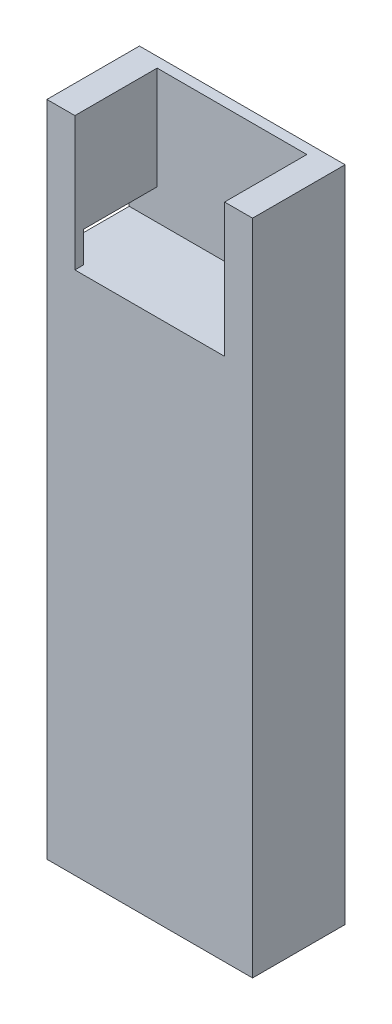
ISO-10303-21;
HEADER;
FILE_DESCRIPTION(('STEP AP214'),'2;1');
FILE_NAME('part.step','',(''),(''),'','','');
FILE_SCHEMA(('AUTOMOTIVE_DESIGN { 1 0 10303 214 1 1 1 1 }'));
ENDSEC;
DATA;
#1=APPLICATION_CONTEXT('core data for automotive mechanical design processes');
#2=APPLICATION_PROTOCOL_DEFINITION('international standard','automotive_design',2000,#1);
#3=PRODUCT_CONTEXT('',#1,'mechanical');
#4=PRODUCT('Part','Part','',(#3));
#5=PRODUCT_RELATED_PRODUCT_CATEGORY('part','',(#4));
#6=PRODUCT_DEFINITION_FORMATION('','',#4);
#7=PRODUCT_DEFINITION_CONTEXT('part definition',#1,'design');
#8=PRODUCT_DEFINITION('design','',#6,#7);
#9=PRODUCT_DEFINITION_SHAPE('','',#8);
#10=(LENGTH_UNIT() NAMED_UNIT(*) SI_UNIT(.MILLI.,.METRE.));
#11=(NAMED_UNIT(*) PLANE_ANGLE_UNIT() SI_UNIT($,.RADIAN.));
#12=(NAMED_UNIT(*) SI_UNIT($,.STERADIAN.) SOLID_ANGLE_UNIT());
#13=UNCERTAINTY_MEASURE_WITH_UNIT(LENGTH_MEASURE(1.E-05),#10,'distance_accuracy_value','');
#14=(GEOMETRIC_REPRESENTATION_CONTEXT(3) GLOBAL_UNCERTAINTY_ASSIGNED_CONTEXT((#13)) GLOBAL_UNIT_ASSIGNED_CONTEXT((#10,
#11,#12)) REPRESENTATION_CONTEXT('',''));
#15=CARTESIAN_POINT('',(0.,0.,0.));
#16=DIRECTION('',(0.,0.,1.));
#17=DIRECTION('',(1.,0.,0.));
#18=AXIS2_PLACEMENT_3D('',#15,#16,#17);
#19=CARTESIAN_POINT('',(0.,0.,0.));
#20=DIRECTION('',(0.,-1.,0.));
#21=DIRECTION('',(0.,0.,-1.));
#22=AXIS2_PLACEMENT_3D('',#19,#20,#21);
#23=PLANE('',#22);
#24=DIRECTION('',(0.,0.,1.));
#25=VECTOR('',#24,1.);
#26=CARTESIAN_POINT('',(0.,0.,0.));
#27=LINE('',#26,#25);
#28=CARTESIAN_POINT('',(0.,0.,-14.2875));
#29=VERTEX_POINT('',#28);
#30=CARTESIAN_POINT('',(0.,0.,0.));
#31=VERTEX_POINT('',#30);
#32=EDGE_CURVE('E359',#29,#31,#27,.T.);
#33=ORIENTED_EDGE('',*,*,#32,.F.);
#34=DIRECTION('',(-1.,0.,0.));
#35=VECTOR('',#34,1.);
#36=CARTESIAN_POINT('',(0.,0.,-14.2875));
#37=LINE('',#36,#35);
#38=CARTESIAN_POINT('',(31.75,0.,-14.2875));
#39=VERTEX_POINT('',#38);
#40=EDGE_CURVE('E374',#39,#29,#37,.T.);
#41=ORIENTED_EDGE('',*,*,#40,.F.);
#42=DIRECTION('',(0.,0.,-1.));
#43=VECTOR('',#42,1.);
#44=CARTESIAN_POINT('',(31.75,0.,0.));
#45=LINE('',#44,#43);
#46=CARTESIAN_POINT('',(31.75,0.,0.));
#47=VERTEX_POINT('',#46);
#48=EDGE_CURVE('E392',#47,#39,#45,.T.);
#49=ORIENTED_EDGE('',*,*,#48,.F.);
#50=DIRECTION('',(1.,0.,0.));
#51=VECTOR('',#50,1.);
#52=CARTESIAN_POINT('',(0.,0.,0.));
#53=LINE('',#52,#51);
#54=EDGE_CURVE('E389',#31,#47,#53,.T.);
#55=ORIENTED_EDGE('',*,*,#54,.F.);
#56=EDGE_LOOP('',(#33,#41,#49,#55));
#57=FACE_BOUND('',#56,.T.);
#58=DIRECTION('',(-1.,0.,0.));
#59=VECTOR('',#58,1.);
#60=CARTESIAN_POINT('',(0.,0.,-12.2555));
#61=LINE('',#60,#59);
#62=CARTESIAN_POINT('',(29.718,0.,-12.2555));
#63=VERTEX_POINT('',#62);
#64=CARTESIAN_POINT('',(2.032,0.,-12.2555));
#65=VERTEX_POINT('',#64);
#66=EDGE_CURVE('E223',#63,#65,#61,.T.);
#67=ORIENTED_EDGE('',*,*,#66,.T.);
#68=DIRECTION('',(0.,0.,1.));
#69=VECTOR('',#68,1.);
#70=CARTESIAN_POINT('',(2.032,0.,0.));
#71=LINE('',#70,#69);
#72=CARTESIAN_POINT('',(2.032,0.,-2.032));
#73=VERTEX_POINT('',#72);
#74=EDGE_CURVE('E251',#65,#73,#71,.T.);
#75=ORIENTED_EDGE('',*,*,#74,.T.);
#76=DIRECTION('',(1.,0.,0.));
#77=VECTOR('',#76,1.);
#78=CARTESIAN_POINT('',(0.,0.,-2.032));
#79=LINE('',#78,#77);
#80=CARTESIAN_POINT('',(29.718,0.,-2.032));
#81=VERTEX_POINT('',#80);
#82=EDGE_CURVE('E276',#73,#81,#79,.T.);
#83=ORIENTED_EDGE('',*,*,#82,.T.);
#84=DIRECTION('',(0.,0.,-1.));
#85=VECTOR('',#84,1.);
#86=CARTESIAN_POINT('',(29.718,0.,0.));
#87=LINE('',#86,#85);
#88=EDGE_CURVE('E62',#81,#63,#87,.T.);
#89=ORIENTED_EDGE('',*,*,#88,.T.);
#90=EDGE_LOOP('',(#67,#75,#83,#89));
#91=FACE_BOUND('',#90,.T.);
#92=ADVANCED_FACE('F46',(#57,#91),#23,.T.);
#93=CARTESIAN_POINT('',(0.,101.6,0.));
#94=DIRECTION('',(1.,0.,0.));
#95=DIRECTION('',(0.,0.,-1.));
#96=AXIS2_PLACEMENT_3D('',#93,#94,#95);
#97=PLANE('',#96);
#98=DIRECTION('',(0.,1.,0.));
#99=VECTOR('',#98,1.);
#100=CARTESIAN_POINT('',(0.,85.725,-1.35426272486975));
#101=LINE('',#100,#99);
#102=CARTESIAN_POINT('',(0.,80.9625,-1.35426272486975));
#103=VERTEX_POINT('',#102);
#104=CARTESIAN_POINT('',(0.,85.725,-1.35426272486975));
#105=VERTEX_POINT('',#104);
#106=EDGE_CURVE('E301',#103,#105,#101,.T.);
#107=ORIENTED_EDGE('',*,*,#106,.F.);
#108=DIRECTION('',(0.,0.,1.));
#109=VECTOR('',#108,1.);
#110=CARTESIAN_POINT('',(0.,80.9625,-1.35426272486975));
#111=LINE('',#110,#109);
#112=CARTESIAN_POINT('',(0.,80.9625,-12.7));
#113=VERTEX_POINT('',#112);
#114=EDGE_CURVE('E70',#113,#103,#111,.T.);
#115=ORIENTED_EDGE('',*,*,#114,.F.);
#116=DIRECTION('',(0.,-1.,0.));
#117=VECTOR('',#116,1.);
#118=CARTESIAN_POINT('',(0.,80.9625,-12.7));
#119=LINE('',#118,#117);
#120=CARTESIAN_POINT('',(0.,85.725,-12.7));
#121=VERTEX_POINT('',#120);
#122=EDGE_CURVE('E309',#121,#113,#119,.T.);
#123=ORIENTED_EDGE('',*,*,#122,.F.);
#124=DIRECTION('',(0.,0.,-1.));
#125=VECTOR('',#124,1.);
#126=CARTESIAN_POINT('',(0.,85.725,-12.7));
#127=LINE('',#126,#125);
#128=EDGE_CURVE('E305',#105,#121,#127,.T.);
#129=ORIENTED_EDGE('',*,*,#128,.F.);
#130=EDGE_LOOP('',(#107,#115,#123,#129));
#131=FACE_BOUND('',#130,.T.);
#132=ORIENTED_EDGE('',*,*,#32,.T.);
#133=DIRECTION('',(0.,-1.,0.));
#134=VECTOR('',#133,1.);
#135=CARTESIAN_POINT('',(0.,101.6,0.));
#136=LINE('',#135,#134);
#137=CARTESIAN_POINT('',(0.,101.6,0.));
#138=VERTEX_POINT('',#137);
#139=EDGE_CURVE('E11',#138,#31,#136,.T.);
#140=ORIENTED_EDGE('',*,*,#139,.F.);
#141=DIRECTION('',(0.,0.,1.));
#142=VECTOR('',#141,1.);
#143=CARTESIAN_POINT('',(0.,101.6,0.));
#144=LINE('',#143,#142);
#145=CARTESIAN_POINT('',(0.,101.6,-14.2875));
#146=VERTEX_POINT('',#145);
#147=EDGE_CURVE('E369',#146,#138,#144,.T.);
#148=ORIENTED_EDGE('',*,*,#147,.F.);
#149=DIRECTION('',(0.,-1.,0.));
#150=VECTOR('',#149,1.);
#151=CARTESIAN_POINT('',(0.,101.6,-14.2875));
#152=LINE('',#151,#150);
#153=EDGE_CURVE('E385',#146,#29,#152,.T.);
#154=ORIENTED_EDGE('',*,*,#153,.T.);
#155=EDGE_LOOP('',(#132,#140,#148,#154));
#156=FACE_BOUND('',#155,.T.);
#157=ADVANCED_FACE('F48',(#131,#156),#97,.F.);
#158=CARTESIAN_POINT('',(0.,101.6,0.));
#159=DIRECTION('',(0.,0.,-1.));
#160=DIRECTION('',(-1.,0.,0.));
#161=AXIS2_PLACEMENT_3D('',#158,#159,#160);
#162=PLANE('',#161);
#163=DIRECTION('',(1.,0.,0.));
#164=VECTOR('',#163,1.);
#165=CARTESIAN_POINT('',(4.318,80.9625,0.));
#166=LINE('',#165,#164);
#167=CARTESIAN_POINT('',(4.318,80.9625,0.));
#168=VERTEX_POINT('',#167);
#169=CARTESIAN_POINT('',(27.432,80.9625,0.));
#170=VERTEX_POINT('',#169);
#171=EDGE_CURVE('E334',#168,#170,#166,.T.);
#172=ORIENTED_EDGE('',*,*,#171,.F.);
#173=DIRECTION('',(0.,1.,0.));
#174=VECTOR('',#173,1.);
#175=CARTESIAN_POINT('',(4.318,80.9625,0.));
#176=LINE('',#175,#174);
#177=CARTESIAN_POINT('',(4.318,101.6,0.));
#178=VERTEX_POINT('',#177);
#179=EDGE_CURVE('E346',#168,#178,#176,.T.);
#180=ORIENTED_EDGE('',*,*,#179,.T.);
#181=DIRECTION('',(1.,0.,0.));
#182=VECTOR('',#181,1.);
#183=CARTESIAN_POINT('',(0.,101.6,0.));
#184=LINE('',#183,#182);
#185=EDGE_CURVE('E375',#138,#178,#184,.T.);
#186=ORIENTED_EDGE('',*,*,#185,.F.);
#187=ORIENTED_EDGE('',*,*,#139,.T.);
#188=ORIENTED_EDGE('',*,*,#54,.T.);
#189=DIRECTION('',(0.,-1.,0.));
#190=VECTOR('',#189,1.);
#191=CARTESIAN_POINT('',(31.75,101.6,0.));
#192=LINE('',#191,#190);
#193=CARTESIAN_POINT('',(31.75,101.6,0.));
#194=VERTEX_POINT('',#193);
#195=EDGE_CURVE('E55',#194,#47,#192,.T.);
#196=ORIENTED_EDGE('',*,*,#195,.F.);
#197=CARTESIAN_POINT('',(27.432,101.6,0.));
#198=VERTEX_POINT('',#197);
#199=EDGE_CURVE('E373',#198,#194,#184,.T.);
#200=ORIENTED_EDGE('',*,*,#199,.F.);
#201=DIRECTION('',(0.,1.,0.));
#202=VECTOR('',#201,1.);
#203=CARTESIAN_POINT('',(27.432,80.9625,0.));
#204=LINE('',#203,#202);
#205=EDGE_CURVE('E363',#170,#198,#204,.T.);
#206=ORIENTED_EDGE('',*,*,#205,.F.);
#207=EDGE_LOOP('',(#172,#180,#186,#187,#188,#196,#200,#206));
#208=FACE_BOUND('',#207,.T.);
#209=ADVANCED_FACE('F486',(#208),#162,.F.);
#210=CARTESIAN_POINT('',(31.75,101.6,0.));
#211=DIRECTION('',(-1.,0.,0.));
#212=DIRECTION('',(0.,0.,1.));
#213=AXIS2_PLACEMENT_3D('',#210,#211,#212);
#214=PLANE('',#213);
#215=ORIENTED_EDGE('',*,*,#48,.T.);
#216=DIRECTION('',(0.,-1.,0.));
#217=VECTOR('',#216,1.);
#218=CARTESIAN_POINT('',(31.75,101.6,-14.2875));
#219=LINE('',#218,#217);
#220=CARTESIAN_POINT('',(31.75,101.6,-14.2875));
#221=VERTEX_POINT('',#220);
#222=EDGE_CURVE('E400',#221,#39,#219,.T.);
#223=ORIENTED_EDGE('',*,*,#222,.F.);
#224=DIRECTION('',(0.,0.,-1.));
#225=VECTOR('',#224,1.);
#226=CARTESIAN_POINT('',(31.75,101.6,0.));
#227=LINE('',#226,#225);
#228=EDGE_CURVE('E379',#194,#221,#227,.T.);
#229=ORIENTED_EDGE('',*,*,#228,.F.);
#230=ORIENTED_EDGE('',*,*,#195,.T.);
#231=EDGE_LOOP('',(#215,#223,#229,#230));
#232=FACE_BOUND('',#231,.T.);
#233=ADVANCED_FACE('F409',(#232),#214,.F.);
#234=CARTESIAN_POINT('',(0.,101.6,-14.2875));
#235=DIRECTION('',(0.,0.,1.));
#236=DIRECTION('',(1.,0.,0.));
#237=AXIS2_PLACEMENT_3D('',#234,#235,#236);
#238=PLANE('',#237);
#239=ORIENTED_EDGE('',*,*,#40,.T.);
#240=ORIENTED_EDGE('',*,*,#153,.F.);
#241=DIRECTION('',(-1.,0.,0.));
#242=VECTOR('',#241,1.);
#243=CARTESIAN_POINT('',(0.,101.6,-14.2875));
#244=LINE('',#243,#242);
#245=EDGE_CURVE('E382',#221,#146,#244,.T.);
#246=ORIENTED_EDGE('',*,*,#245,.F.);
#247=ORIENTED_EDGE('',*,*,#222,.T.);
#248=EDGE_LOOP('',(#239,#240,#246,#247));
#249=FACE_BOUND('',#248,.T.);
#250=ADVANCED_FACE('F419',(#249),#238,.F.);
#251=CARTESIAN_POINT('',(0.,101.6,0.));
#252=DIRECTION('',(0.,-1.,0.));
#253=DIRECTION('',(0.,0.,-1.));
#254=AXIS2_PLACEMENT_3D('',#251,#252,#253);
#255=PLANE('',#254);
#256=ORIENTED_EDGE('',*,*,#185,.T.);
#257=DIRECTION('',(0.,0.,1.));
#258=VECTOR('',#257,1.);
#259=CARTESIAN_POINT('',(4.318,101.6,0.));
#260=LINE('',#259,#258);
#261=CARTESIAN_POINT('',(4.318,101.6,-12.7));
#262=VERTEX_POINT('',#261);
#263=EDGE_CURVE('E330',#262,#178,#260,.T.);
#264=ORIENTED_EDGE('',*,*,#263,.F.);
#265=DIRECTION('',(-1.,0.,0.));
#266=VECTOR('',#265,1.);
#267=CARTESIAN_POINT('',(4.318,101.6,-12.7));
#268=LINE('',#267,#266);
#269=CARTESIAN_POINT('',(27.432,101.6,-12.7));
#270=VERTEX_POINT('',#269);
#271=EDGE_CURVE('E335',#270,#262,#268,.T.);
#272=ORIENTED_EDGE('',*,*,#271,.F.);
#273=DIRECTION('',(0.,0.,-1.));
#274=VECTOR('',#273,1.);
#275=CARTESIAN_POINT('',(27.432,101.6,0.));
#276=LINE('',#275,#274);
#277=EDGE_CURVE('E349',#198,#270,#276,.T.);
#278=ORIENTED_EDGE('',*,*,#277,.F.);
#279=ORIENTED_EDGE('',*,*,#199,.T.);
#280=ORIENTED_EDGE('',*,*,#228,.T.);
#281=ORIENTED_EDGE('',*,*,#245,.T.);
#282=ORIENTED_EDGE('',*,*,#147,.T.);
#283=EDGE_LOOP('',(#256,#264,#272,#278,#279,#280,#281,#282));
#284=FACE_BOUND('',#283,.T.);
#285=ADVANCED_FACE('F425',(#284),#255,.F.);
#286=CARTESIAN_POINT('',(4.318,80.9625,0.));
#287=DIRECTION('',(-1.,0.,0.));
#288=DIRECTION('',(0.,0.,1.));
#289=AXIS2_PLACEMENT_3D('',#286,#287,#288);
#290=PLANE('',#289);
#291=DIRECTION('',(0.,1.,0.));
#292=VECTOR('',#291,1.);
#293=CARTESIAN_POINT('',(4.318,80.9625,-1.35426272486975));
#294=LINE('',#293,#292);
#295=CARTESIAN_POINT('',(4.318,80.9625,-1.35426272486975));
#296=VERTEX_POINT('',#295);
#297=CARTESIAN_POINT('',(4.318,85.725,-1.35426272486975));
#298=VERTEX_POINT('',#297);
#299=EDGE_CURVE('E317',#296,#298,#294,.T.);
#300=ORIENTED_EDGE('',*,*,#299,.T.);
#301=DIRECTION('',(0.,0.,-1.));
#302=VECTOR('',#301,1.);
#303=CARTESIAN_POINT('',(4.318,85.725,0.));
#304=LINE('',#303,#302);
#305=CARTESIAN_POINT('',(4.318,85.725,-12.7));
#306=VERTEX_POINT('',#305);
#307=EDGE_CURVE('E326',#298,#306,#304,.T.);
#308=ORIENTED_EDGE('',*,*,#307,.T.);
#309=DIRECTION('',(0.,1.,0.));
#310=VECTOR('',#309,1.);
#311=CARTESIAN_POINT('',(4.318,80.9625,-12.7));
#312=LINE('',#311,#310);
#313=EDGE_CURVE('E356',#306,#262,#312,.T.);
#314=ORIENTED_EDGE('',*,*,#313,.T.);
#315=ORIENTED_EDGE('',*,*,#263,.T.);
#316=ORIENTED_EDGE('',*,*,#179,.F.);
#317=DIRECTION('',(0.,0.,1.));
#318=VECTOR('',#317,1.);
#319=CARTESIAN_POINT('',(4.318,80.9625,0.));
#320=LINE('',#319,#318);
#321=EDGE_CURVE('E331',#296,#168,#320,.T.);
#322=ORIENTED_EDGE('',*,*,#321,.F.);
#323=EDGE_LOOP('',(#300,#308,#314,#315,#316,#322));
#324=FACE_BOUND('',#323,.T.);
#325=ADVANCED_FACE('F504',(#324),#290,.F.);
#326=CARTESIAN_POINT('',(4.318,80.9625,-12.7));
#327=DIRECTION('',(0.,0.,-1.));
#328=DIRECTION('',(-1.,0.,0.));
#329=AXIS2_PLACEMENT_3D('',#326,#327,#328);
#330=PLANE('',#329);
#331=ORIENTED_EDGE('',*,*,#313,.F.);
#332=DIRECTION('',(-1.,0.,0.));
#333=VECTOR('',#332,1.);
#334=CARTESIAN_POINT('',(9.20749999999997,85.725,-12.7));
#335=LINE('',#334,#333);
#336=EDGE_CURVE('E314',#306,#121,#335,.T.);
#337=ORIENTED_EDGE('',*,*,#336,.T.);
#338=ORIENTED_EDGE('',*,*,#122,.T.);
#339=DIRECTION('',(-1.,0.,0.));
#340=VECTOR('',#339,1.);
#341=CARTESIAN_POINT('',(4.318,80.9625,-12.7));
#342=LINE('',#341,#340);
#343=CARTESIAN_POINT('',(27.432,80.9625,-12.7));
#344=VERTEX_POINT('',#343);
#345=EDGE_CURVE('E343',#344,#113,#342,.T.);
#346=ORIENTED_EDGE('',*,*,#345,.F.);
#347=DIRECTION('',(0.,1.,0.));
#348=VECTOR('',#347,1.);
#349=CARTESIAN_POINT('',(27.432,80.9625,-12.7));
#350=LINE('',#349,#348);
#351=EDGE_CURVE('E360',#344,#270,#350,.T.);
#352=ORIENTED_EDGE('',*,*,#351,.T.);
#353=ORIENTED_EDGE('',*,*,#271,.T.);
#354=EDGE_LOOP('',(#331,#337,#338,#346,#352,#353));
#355=FACE_BOUND('',#354,.T.);
#356=ADVANCED_FACE('F507',(#355),#330,.F.);
#357=CARTESIAN_POINT('',(27.432,80.9625,0.));
#358=DIRECTION('',(1.,0.,0.));
#359=DIRECTION('',(0.,0.,-1.));
#360=AXIS2_PLACEMENT_3D('',#357,#358,#359);
#361=PLANE('',#360);
#362=ORIENTED_EDGE('',*,*,#277,.T.);
#363=ORIENTED_EDGE('',*,*,#351,.F.);
#364=DIRECTION('',(0.,0.,-1.));
#365=VECTOR('',#364,1.);
#366=CARTESIAN_POINT('',(27.432,80.9625,0.));
#367=LINE('',#366,#365);
#368=EDGE_CURVE('E339',#170,#344,#367,.T.);
#369=ORIENTED_EDGE('',*,*,#368,.F.);
#370=ORIENTED_EDGE('',*,*,#205,.T.);
#371=EDGE_LOOP('',(#362,#363,#369,#370));
#372=FACE_BOUND('',#371,.T.);
#373=ADVANCED_FACE('F509',(#372),#361,.F.);
#374=CARTESIAN_POINT('',(0.,80.9625,0.));
#375=DIRECTION('',(0.,-1.,0.));
#376=DIRECTION('',(0.,0.,-1.));
#377=AXIS2_PLACEMENT_3D('',#374,#375,#376);
#378=PLANE('',#377);
#379=ORIENTED_EDGE('',*,*,#345,.T.);
#380=ORIENTED_EDGE('',*,*,#114,.T.);
#381=DIRECTION('',(-1.,0.,0.));
#382=VECTOR('',#381,1.);
#383=CARTESIAN_POINT('',(9.20749999999997,80.9625,-1.35426272486975));
#384=LINE('',#383,#382);
#385=EDGE_CURVE('E313',#296,#103,#384,.T.);
#386=ORIENTED_EDGE('',*,*,#385,.F.);
#387=ORIENTED_EDGE('',*,*,#321,.T.);
#388=ORIENTED_EDGE('',*,*,#171,.T.);
#389=ORIENTED_EDGE('',*,*,#368,.T.);
#390=EDGE_LOOP('',(#379,#380,#386,#387,#388,#389));
#391=FACE_BOUND('',#390,.T.);
#392=ADVANCED_FACE('F500',(#391),#378,.F.);
#393=CARTESIAN_POINT('',(9.20749999999997,85.725,-12.7));
#394=DIRECTION('',(0.,1.,0.));
#395=DIRECTION('',(0.,0.,1.));
#396=AXIS2_PLACEMENT_3D('',#393,#394,#395);
#397=PLANE('',#396);
#398=DIRECTION('',(-1.,0.,0.));
#399=VECTOR('',#398,1.);
#400=CARTESIAN_POINT('',(9.20749999999997,85.725,-1.35426272486975));
#401=LINE('',#400,#399);
#402=EDGE_CURVE('E318',#298,#105,#401,.T.);
#403=ORIENTED_EDGE('',*,*,#402,.T.);
#404=ORIENTED_EDGE('',*,*,#128,.T.);
#405=ORIENTED_EDGE('',*,*,#336,.F.);
#406=ORIENTED_EDGE('',*,*,#307,.F.);
#407=EDGE_LOOP('',(#403,#404,#405,#406));
#408=FACE_BOUND('',#407,.T.);
#409=ADVANCED_FACE('F515',(#408),#397,.F.);
#410=CARTESIAN_POINT('',(9.20749999999997,85.725,-1.35426272486975));
#411=DIRECTION('',(0.,0.,1.));
#412=DIRECTION('',(0.,-1.,0.));
#413=AXIS2_PLACEMENT_3D('',#410,#411,#412);
#414=PLANE('',#413);
#415=ORIENTED_EDGE('',*,*,#385,.T.);
#416=ORIENTED_EDGE('',*,*,#106,.T.);
#417=ORIENTED_EDGE('',*,*,#402,.F.);
#418=ORIENTED_EDGE('',*,*,#299,.F.);
#419=EDGE_LOOP('',(#415,#416,#417,#418));
#420=FACE_BOUND('',#419,.T.);
#421=ADVANCED_FACE('F564',(#420),#414,.F.);
#422=CARTESIAN_POINT('',(0.,101.6,-2.032));
#423=DIRECTION('',(0.,0.,-1.));
#424=DIRECTION('',(-1.,0.,0.));
#425=AXIS2_PLACEMENT_3D('',#422,#423,#424);
#426=PLANE('',#425);
#427=DIRECTION('',(1.,0.,0.));
#428=VECTOR('',#427,1.);
#429=CARTESIAN_POINT('',(0.,78.9305,-2.032));
#430=LINE('',#429,#428);
#431=CARTESIAN_POINT('',(2.032,78.9305,-2.032));
#432=VERTEX_POINT('',#431);
#433=CARTESIAN_POINT('',(29.464,78.9305,-2.032));
#434=VERTEX_POINT('',#433);
#435=EDGE_CURVE('E236',#432,#434,#430,.T.);
#436=ORIENTED_EDGE('',*,*,#435,.T.);
#437=DIRECTION('',(0.,1.,0.));
#438=VECTOR('',#437,1.);
#439=CARTESIAN_POINT('',(29.464,80.9625,-2.032));
#440=LINE('',#439,#438);
#441=CARTESIAN_POINT('',(29.464,99.568,-2.032));
#442=VERTEX_POINT('',#441);
#443=EDGE_CURVE('E244',#434,#442,#440,.T.);
#444=ORIENTED_EDGE('',*,*,#443,.T.);
#445=DIRECTION('',(1.,0.,0.));
#446=VECTOR('',#445,1.);
#447=CARTESIAN_POINT('',(0.,99.568,-2.032));
#448=LINE('',#447,#446);
#449=CARTESIAN_POINT('',(29.718,99.568,-2.032));
#450=VERTEX_POINT('',#449);
#451=EDGE_CURVE('E216',#442,#450,#448,.T.);
#452=ORIENTED_EDGE('',*,*,#451,.T.);
#453=DIRECTION('',(0.,-1.,0.));
#454=VECTOR('',#453,1.);
#455=CARTESIAN_POINT('',(29.718,101.6,-2.032));
#456=LINE('',#455,#454);
#457=EDGE_CURVE('E204',#450,#81,#456,.T.);
#458=ORIENTED_EDGE('',*,*,#457,.T.);
#459=ORIENTED_EDGE('',*,*,#82,.F.);
#460=DIRECTION('',(0.,-1.,0.));
#461=VECTOR('',#460,1.);
#462=CARTESIAN_POINT('',(2.032,101.6,-2.032));
#463=LINE('',#462,#461);
#464=EDGE_CURVE('E203',#432,#73,#463,.T.);
#465=ORIENTED_EDGE('',*,*,#464,.F.);
#466=EDGE_LOOP('',(#436,#444,#452,#458,#459,#465));
#467=FACE_BOUND('',#466,.T.);
#468=ADVANCED_FACE('F455',(#467),#426,.T.);
#469=CARTESIAN_POINT('',(2.032,101.6,0.));
#470=DIRECTION('',(1.,0.,0.));
#471=DIRECTION('',(0.,0.,-1.));
#472=AXIS2_PLACEMENT_3D('',#469,#470,#471);
#473=PLANE('',#472);
#474=ORIENTED_EDGE('',*,*,#464,.T.);
#475=ORIENTED_EDGE('',*,*,#74,.F.);
#476=DIRECTION('',(0.,-1.,0.));
#477=VECTOR('',#476,1.);
#478=CARTESIAN_POINT('',(2.032,101.6,-12.2555));
#479=LINE('',#478,#477);
#480=CARTESIAN_POINT('',(2.032,78.9305,-12.2555));
#481=VERTEX_POINT('',#480);
#482=EDGE_CURVE('E235',#481,#65,#479,.T.);
#483=ORIENTED_EDGE('',*,*,#482,.F.);
#484=DIRECTION('',(0.,0.,1.));
#485=VECTOR('',#484,1.);
#486=CARTESIAN_POINT('',(2.032,78.9305,0.));
#487=LINE('',#486,#485);
#488=EDGE_CURVE('E443',#481,#432,#487,.T.);
#489=ORIENTED_EDGE('',*,*,#488,.T.);
#490=EDGE_LOOP('',(#474,#475,#483,#489));
#491=FACE_BOUND('',#490,.T.);
#492=ADVANCED_FACE('F451',(#491),#473,.T.);
#493=CARTESIAN_POINT('',(29.718,101.6,0.));
#494=DIRECTION('',(-1.,0.,0.));
#495=DIRECTION('',(0.,0.,1.));
#496=AXIS2_PLACEMENT_3D('',#493,#494,#495);
#497=PLANE('',#496);
#498=ORIENTED_EDGE('',*,*,#88,.F.);
#499=ORIENTED_EDGE('',*,*,#457,.F.);
#500=DIRECTION('',(0.,0.,-1.));
#501=VECTOR('',#500,1.);
#502=CARTESIAN_POINT('',(29.718,99.568,0.));
#503=LINE('',#502,#501);
#504=CARTESIAN_POINT('',(29.718,99.568,-12.2555));
#505=VERTEX_POINT('',#504);
#506=EDGE_CURVE('E215',#450,#505,#503,.T.);
#507=ORIENTED_EDGE('',*,*,#506,.T.);
#508=DIRECTION('',(0.,-1.,0.));
#509=VECTOR('',#508,1.);
#510=CARTESIAN_POINT('',(29.718,101.6,-12.2555));
#511=LINE('',#510,#509);
#512=EDGE_CURVE('E234',#505,#63,#511,.T.);
#513=ORIENTED_EDGE('',*,*,#512,.T.);
#514=EDGE_LOOP('',(#498,#499,#507,#513));
#515=FACE_BOUND('',#514,.T.);
#516=ADVANCED_FACE('F469',(#515),#497,.T.);
#517=CARTESIAN_POINT('',(0.,101.6,-12.2555));
#518=DIRECTION('',(0.,0.,1.));
#519=DIRECTION('',(1.,0.,0.));
#520=AXIS2_PLACEMENT_3D('',#517,#518,#519);
#521=PLANE('',#520);
#522=ORIENTED_EDGE('',*,*,#482,.T.);
#523=ORIENTED_EDGE('',*,*,#66,.F.);
#524=ORIENTED_EDGE('',*,*,#512,.F.);
#525=DIRECTION('',(-1.,0.,0.));
#526=VECTOR('',#525,1.);
#527=CARTESIAN_POINT('',(0.,99.568,-12.2555));
#528=LINE('',#527,#526);
#529=CARTESIAN_POINT('',(29.464,99.568,-12.2555));
#530=VERTEX_POINT('',#529);
#531=EDGE_CURVE('E257',#505,#530,#528,.T.);
#532=ORIENTED_EDGE('',*,*,#531,.T.);
#533=DIRECTION('',(0.,-1.,0.));
#534=VECTOR('',#533,1.);
#535=CARTESIAN_POINT('',(29.464,80.9625,-12.2555));
#536=LINE('',#535,#534);
#537=CARTESIAN_POINT('',(29.464,78.9305,-12.2555));
#538=VERTEX_POINT('',#537);
#539=EDGE_CURVE('E288',#530,#538,#536,.T.);
#540=ORIENTED_EDGE('',*,*,#539,.T.);
#541=DIRECTION('',(1.,0.,0.));
#542=VECTOR('',#541,1.);
#543=CARTESIAN_POINT('',(0.,78.9305,-12.2555));
#544=LINE('',#543,#542);
#545=EDGE_CURVE('E291',#481,#538,#544,.T.);
#546=ORIENTED_EDGE('',*,*,#545,.F.);
#547=EDGE_LOOP('',(#522,#523,#524,#532,#540,#546));
#548=FACE_BOUND('',#547,.T.);
#549=ADVANCED_FACE('F460',(#548),#521,.T.);
#550=CARTESIAN_POINT('',(0.,99.568,0.));
#551=DIRECTION('',(0.,-1.,0.));
#552=DIRECTION('',(0.,0.,-1.));
#553=AXIS2_PLACEMENT_3D('',#550,#551,#552);
#554=PLANE('',#553);
#555=ORIENTED_EDGE('',*,*,#531,.F.);
#556=ORIENTED_EDGE('',*,*,#506,.F.);
#557=ORIENTED_EDGE('',*,*,#451,.F.);
#558=DIRECTION('',(0.,0.,-1.));
#559=VECTOR('',#558,1.);
#560=CARTESIAN_POINT('',(29.464,99.568,0.));
#561=LINE('',#560,#559);
#562=EDGE_CURVE('E241',#442,#530,#561,.T.);
#563=ORIENTED_EDGE('',*,*,#562,.T.);
#564=EDGE_LOOP('',(#555,#556,#557,#563));
#565=FACE_BOUND('',#564,.T.);
#566=ADVANCED_FACE('F468',(#565),#554,.T.);
#567=CARTESIAN_POINT('',(29.464,80.9625,0.));
#568=DIRECTION('',(1.,0.,0.));
#569=DIRECTION('',(0.,0.,-1.));
#570=AXIS2_PLACEMENT_3D('',#567,#568,#569);
#571=PLANE('',#570);
#572=ORIENTED_EDGE('',*,*,#562,.F.);
#573=ORIENTED_EDGE('',*,*,#443,.F.);
#574=DIRECTION('',(0.,0.,-1.));
#575=VECTOR('',#574,1.);
#576=CARTESIAN_POINT('',(29.464,78.9305,0.));
#577=LINE('',#576,#575);
#578=EDGE_CURVE('E240',#434,#538,#577,.T.);
#579=ORIENTED_EDGE('',*,*,#578,.T.);
#580=ORIENTED_EDGE('',*,*,#539,.F.);
#581=EDGE_LOOP('',(#572,#573,#579,#580));
#582=FACE_BOUND('',#581,.T.);
#583=ADVANCED_FACE('F464',(#582),#571,.T.);
#584=CARTESIAN_POINT('',(0.,78.9305,0.));
#585=DIRECTION('',(0.,-1.,0.));
#586=DIRECTION('',(0.,0.,-1.));
#587=AXIS2_PLACEMENT_3D('',#584,#585,#586);
#588=PLANE('',#587);
#589=ORIENTED_EDGE('',*,*,#545,.T.);
#590=ORIENTED_EDGE('',*,*,#578,.F.);
#591=ORIENTED_EDGE('',*,*,#435,.F.);
#592=ORIENTED_EDGE('',*,*,#488,.F.);
#593=EDGE_LOOP('',(#589,#590,#591,#592));
#594=FACE_BOUND('',#593,.T.);
#595=ADVANCED_FACE('F462',(#594),#588,.T.);
#596=CLOSED_SHELL('',(#92,#157,#209,#233,#250,#285,#325,#356,#373,#392,#409,#421,#468,#492,#516,
#549,#566,#583,#595));
#597=CARTESIAN_POINT('',(9.20749999999997,87.757,-12.7));
#598=DIRECTION('',(0.,1.,0.));
#599=DIRECTION('',(0.,0.,1.));
#600=AXIS2_PLACEMENT_3D('',#597,#598,#599);
#601=PLANE('',#600);
#602=DIRECTION('',(0.,0.,-1.));
#603=VECTOR('',#602,1.);
#604=CARTESIAN_POINT('',(2.032,87.757,-12.7));
#605=LINE('',#604,#603);
#606=CARTESIAN_POINT('',(2.032,87.757,-2.032));
#607=VERTEX_POINT('',#606);
#608=CARTESIAN_POINT('',(2.032,87.757,-12.2555));
#609=VERTEX_POINT('',#608);
#610=EDGE_CURVE('E270',#607,#609,#605,.T.);
#611=ORIENTED_EDGE('',*,*,#610,.F.);
#612=DIRECTION('',(-1.,0.,0.));
#613=VECTOR('',#612,1.);
#614=CARTESIAN_POINT('',(9.20749999999997,87.757,-2.032));
#615=LINE('',#614,#613);
#616=CARTESIAN_POINT('',(2.286,87.757,-2.032));
#617=VERTEX_POINT('',#616);
#618=EDGE_CURVE('E197',#617,#607,#615,.T.);
#619=ORIENTED_EDGE('',*,*,#618,.F.);
#620=DIRECTION('',(0.,0.,-1.));
#621=VECTOR('',#620,1.);
#622=CARTESIAN_POINT('',(2.286,87.757,0.));
#623=LINE('',#622,#621);
#624=CARTESIAN_POINT('',(2.286,87.757,-12.2555));
#625=VERTEX_POINT('',#624);
#626=EDGE_CURVE('E263',#617,#625,#623,.T.);
#627=ORIENTED_EDGE('',*,*,#626,.T.);
#628=DIRECTION('',(1.,0.,0.));
#629=VECTOR('',#628,1.);
#630=CARTESIAN_POINT('',(9.20749999999997,87.757,-12.2555));
#631=LINE('',#630,#629);
#632=EDGE_CURVE('E295',#609,#625,#631,.T.);
#633=ORIENTED_EDGE('',*,*,#632,.F.);
#634=EDGE_LOOP('',(#611,#619,#627,#633));
#635=FACE_BOUND('',#634,.T.);
#636=ADVANCED_FACE('F441',(#635),#601,.T.);
#637=CARTESIAN_POINT('',(2.286,80.9625,0.));
#638=DIRECTION('',(-1.,0.,0.));
#639=DIRECTION('',(0.,0.,1.));
#640=AXIS2_PLACEMENT_3D('',#637,#638,#639);
#641=PLANE('',#640);
#642=DIRECTION('',(0.,-1.,0.));
#643=VECTOR('',#642,1.);
#644=CARTESIAN_POINT('',(2.286,101.6,-12.2555));
#645=LINE('',#644,#643);
#646=CARTESIAN_POINT('',(2.286,99.568,-12.2555));
#647=VERTEX_POINT('',#646);
#648=EDGE_CURVE('E285',#647,#625,#645,.T.);
#649=ORIENTED_EDGE('',*,*,#648,.T.);
#650=ORIENTED_EDGE('',*,*,#626,.F.);
#651=DIRECTION('',(0.,1.,0.));
#652=VECTOR('',#651,1.);
#653=CARTESIAN_POINT('',(2.286,101.6,-2.032));
#654=LINE('',#653,#652);
#655=CARTESIAN_POINT('',(2.286,99.568,-2.032));
#656=VERTEX_POINT('',#655);
#657=EDGE_CURVE('E242',#617,#656,#654,.T.);
#658=ORIENTED_EDGE('',*,*,#657,.T.);
#659=DIRECTION('',(0.,0.,1.));
#660=VECTOR('',#659,1.);
#661=CARTESIAN_POINT('',(2.286,99.568,0.));
#662=LINE('',#661,#660);
#663=EDGE_CURVE('E212',#647,#656,#662,.T.);
#664=ORIENTED_EDGE('',*,*,#663,.F.);
#665=EDGE_LOOP('',(#649,#650,#658,#664));
#666=FACE_BOUND('',#665,.T.);
#667=ADVANCED_FACE('F438',(#666),#641,.T.);
#668=ORIENTED_EDGE('',*,*,#618,.T.);
#669=CARTESIAN_POINT('',(2.032,99.568,-2.032));
#670=VERTEX_POINT('',#669);
#671=EDGE_CURVE('E192',#670,#607,#463,.T.);
#672=ORIENTED_EDGE('',*,*,#671,.F.);
#673=DIRECTION('',(1.,0.,0.));
#674=VECTOR('',#673,1.);
#675=CARTESIAN_POINT('',(0.,99.568,-2.032));
#676=LINE('',#675,#674);
#677=EDGE_CURVE('E196',#670,#656,#676,.T.);
#678=ORIENTED_EDGE('',*,*,#677,.T.);
#679=ORIENTED_EDGE('',*,*,#657,.F.);
#680=EDGE_LOOP('',(#668,#672,#678,#679));
#681=FACE_BOUND('',#680,.T.);
#682=ADVANCED_FACE('F194',(#681),#426,.T.);
#683=ORIENTED_EDGE('',*,*,#610,.T.);
#684=CARTESIAN_POINT('',(2.032,99.568,-12.2555));
#685=VERTEX_POINT('',#684);
#686=EDGE_CURVE('E221',#685,#609,#479,.T.);
#687=ORIENTED_EDGE('',*,*,#686,.F.);
#688=DIRECTION('',(0.,0.,1.));
#689=VECTOR('',#688,1.);
#690=CARTESIAN_POINT('',(2.032,99.568,0.));
#691=LINE('',#690,#689);
#692=EDGE_CURVE('E210',#685,#670,#691,.T.);
#693=ORIENTED_EDGE('',*,*,#692,.T.);
#694=ORIENTED_EDGE('',*,*,#671,.T.);
#695=EDGE_LOOP('',(#683,#687,#693,#694));
#696=FACE_BOUND('',#695,.T.);
#697=ADVANCED_FACE('F219',(#696),#473,.T.);
#698=ORIENTED_EDGE('',*,*,#663,.T.);
#699=ORIENTED_EDGE('',*,*,#677,.F.);
#700=ORIENTED_EDGE('',*,*,#692,.F.);
#701=EDGE_CURVE('E256',#647,#685,#528,.T.);
#702=ORIENTED_EDGE('',*,*,#701,.F.);
#703=EDGE_LOOP('',(#698,#699,#700,#702));
#704=FACE_BOUND('',#703,.T.);
#705=ADVANCED_FACE('F208',(#704),#554,.T.);
#706=ORIENTED_EDGE('',*,*,#632,.T.);
#707=ORIENTED_EDGE('',*,*,#648,.F.);
#708=ORIENTED_EDGE('',*,*,#701,.T.);
#709=ORIENTED_EDGE('',*,*,#686,.T.);
#710=EDGE_LOOP('',(#706,#707,#708,#709));
#711=FACE_BOUND('',#710,.T.);
#712=ADVANCED_FACE('F436',(#711),#521,.T.);
#713=CLOSED_SHELL('',(#636,#667,#682,#697,#705,#712));
#714=ORIENTED_CLOSED_SHELL('',*,#713,.T.);
#715=BREP_WITH_VOIDS('B2',#596,(#714));
#716=ADVANCED_BREP_SHAPE_REPRESENTATION('',(#18,#715),#14);
#717=SHAPE_DEFINITION_REPRESENTATION(#9,#716);
ENDSEC;
END-ISO-10303-21;
